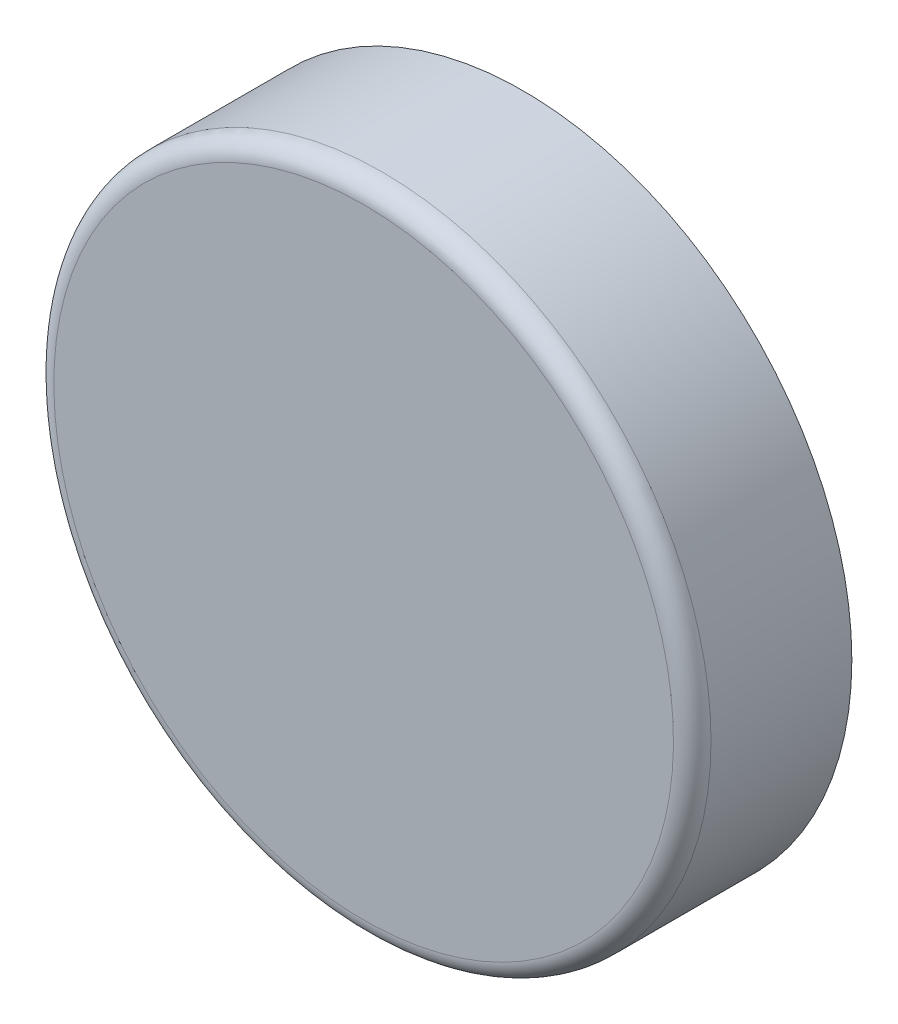
ISO-10303-21;
HEADER;
FILE_DESCRIPTION(('STEP AP214'),'2;1');
FILE_NAME('part.step','',(''),(''),'','','');
FILE_SCHEMA(('AUTOMOTIVE_DESIGN { 1 0 10303 214 1 1 1 1 }'));
ENDSEC;
DATA;
#1=APPLICATION_CONTEXT('core data for automotive mechanical design processes');
#2=APPLICATION_PROTOCOL_DEFINITION('international standard','automotive_design',2000,#1);
#3=PRODUCT_CONTEXT('',#1,'mechanical');
#4=PRODUCT('Part','Part','',(#3));
#5=PRODUCT_RELATED_PRODUCT_CATEGORY('part','',(#4));
#6=PRODUCT_DEFINITION_FORMATION('','',#4);
#7=PRODUCT_DEFINITION_CONTEXT('part definition',#1,'design');
#8=PRODUCT_DEFINITION('design','',#6,#7);
#9=PRODUCT_DEFINITION_SHAPE('','',#8);
#10=(LENGTH_UNIT() NAMED_UNIT(*) SI_UNIT(.MILLI.,.METRE.));
#11=(NAMED_UNIT(*) PLANE_ANGLE_UNIT() SI_UNIT($,.RADIAN.));
#12=(NAMED_UNIT(*) SI_UNIT($,.STERADIAN.) SOLID_ANGLE_UNIT());
#13=UNCERTAINTY_MEASURE_WITH_UNIT(LENGTH_MEASURE(1.E-05),#10,'distance_accuracy_value','');
#14=(GEOMETRIC_REPRESENTATION_CONTEXT(3) GLOBAL_UNCERTAINTY_ASSIGNED_CONTEXT((#13)) GLOBAL_UNIT_ASSIGNED_CONTEXT((#10,
#11,#12)) REPRESENTATION_CONTEXT('',''));
#15=CARTESIAN_POINT('',(0.,0.,0.));
#16=DIRECTION('',(0.,0.,1.));
#17=DIRECTION('',(1.,0.,0.));
#18=AXIS2_PLACEMENT_3D('',#15,#16,#17);
#19=CARTESIAN_POINT('',(0.,0.,4.3));
#20=DIRECTION('',(0.,0.,1.));
#21=DIRECTION('',(1.,0.,0.));
#22=AXIS2_PLACEMENT_3D('',#19,#20,#21);
#23=PLANE('',#22);
#24=CARTESIAN_POINT('',(0.,0.,4.3));
#25=DIRECTION('',(0.,0.,-1.));
#26=DIRECTION('',(0.,1.,0.));
#27=AXIS2_PLACEMENT_3D('',#24,#25,#26);
#28=CIRCLE('',#27,1.65);
#29=CARTESIAN_POINT('',(0.,1.65,4.3));
#30=VERTEX_POINT('',#29);
#31=EDGE_CURVE('E27',#30,#30,#28,.T.);
#32=ORIENTED_EDGE('',*,*,#31,.F.);
#33=EDGE_LOOP('',(#32));
#34=FACE_BOUND('',#33,.T.);
#35=ADVANCED_FACE('F23',(#34),#23,.T.);
#36=CARTESIAN_POINT('',(0.,0.,4.2));
#37=DIRECTION('',(0.,0.,-1.));
#38=DIRECTION('',(0.,1.,0.));
#39=AXIS2_PLACEMENT_3D('',#36,#37,#38);
#40=TOROIDAL_SURFACE('',#39,1.65,0.0999999999999997);
#41=CARTESIAN_POINT('',(0.,0.,4.2));
#42=DIRECTION('',(0.,0.,1.));
#43=DIRECTION('',(1.,0.,0.));
#44=AXIS2_PLACEMENT_3D('',#41,#42,#43);
#45=CIRCLE('',#44,1.75);
#46=CARTESIAN_POINT('',(1.75,0.,4.2));
#47=VERTEX_POINT('',#46);
#48=EDGE_CURVE('E31',#47,#47,#45,.F.);
#49=ORIENTED_EDGE('',*,*,#48,.F.);
#50=EDGE_LOOP('',(#49));
#51=FACE_BOUND('',#50,.T.);
#52=ORIENTED_EDGE('',*,*,#31,.T.);
#53=EDGE_LOOP('',(#52));
#54=FACE_BOUND('',#53,.T.);
#55=ADVANCED_FACE('F25',(#51,#54),#40,.T.);
#56=CARTESIAN_POINT('',(0.,0.,3.45));
#57=DIRECTION('',(0.,0.,1.));
#58=DIRECTION('',(1.,0.,0.));
#59=AXIS2_PLACEMENT_3D('',#56,#57,#58);
#60=CYLINDRICAL_SURFACE('',#59,1.75);
#61=ORIENTED_EDGE('',*,*,#48,.T.);
#62=EDGE_LOOP('',(#61));
#63=FACE_BOUND('',#62,.T.);
#64=CARTESIAN_POINT('',(0.,0.,3.45));
#65=DIRECTION('',(0.,0.,1.));
#66=DIRECTION('',(1.,0.,0.));
#67=AXIS2_PLACEMENT_3D('',#64,#65,#66);
#68=CIRCLE('',#67,1.75);
#69=CARTESIAN_POINT('',(1.75,0.,3.45));
#70=VERTEX_POINT('',#69);
#71=EDGE_CURVE('E12',#70,#70,#68,.T.);
#72=ORIENTED_EDGE('',*,*,#71,.T.);
#73=EDGE_LOOP('',(#72));
#74=FACE_BOUND('',#73,.T.);
#75=ADVANCED_FACE('F47',(#63,#74),#60,.T.);
#76=CARTESIAN_POINT('',(0.,0.,3.45));
#77=DIRECTION('',(0.,0.,1.));
#78=DIRECTION('',(1.,0.,0.));
#79=AXIS2_PLACEMENT_3D('',#76,#77,#78);
#80=PLANE('',#79);
#81=ORIENTED_EDGE('',*,*,#71,.F.);
#82=EDGE_LOOP('',(#81));
#83=FACE_BOUND('',#82,.T.);
#84=ADVANCED_FACE('F50',(#83),#80,.F.);
#85=CLOSED_SHELL('',(#35,#55,#75,#84));
#86=MANIFOLD_SOLID_BREP('B1',#85);
#87=ADVANCED_BREP_SHAPE_REPRESENTATION('',(#18,#86),#14);
#88=SHAPE_DEFINITION_REPRESENTATION(#9,#87);
ENDSEC;
END-ISO-10303-21;
